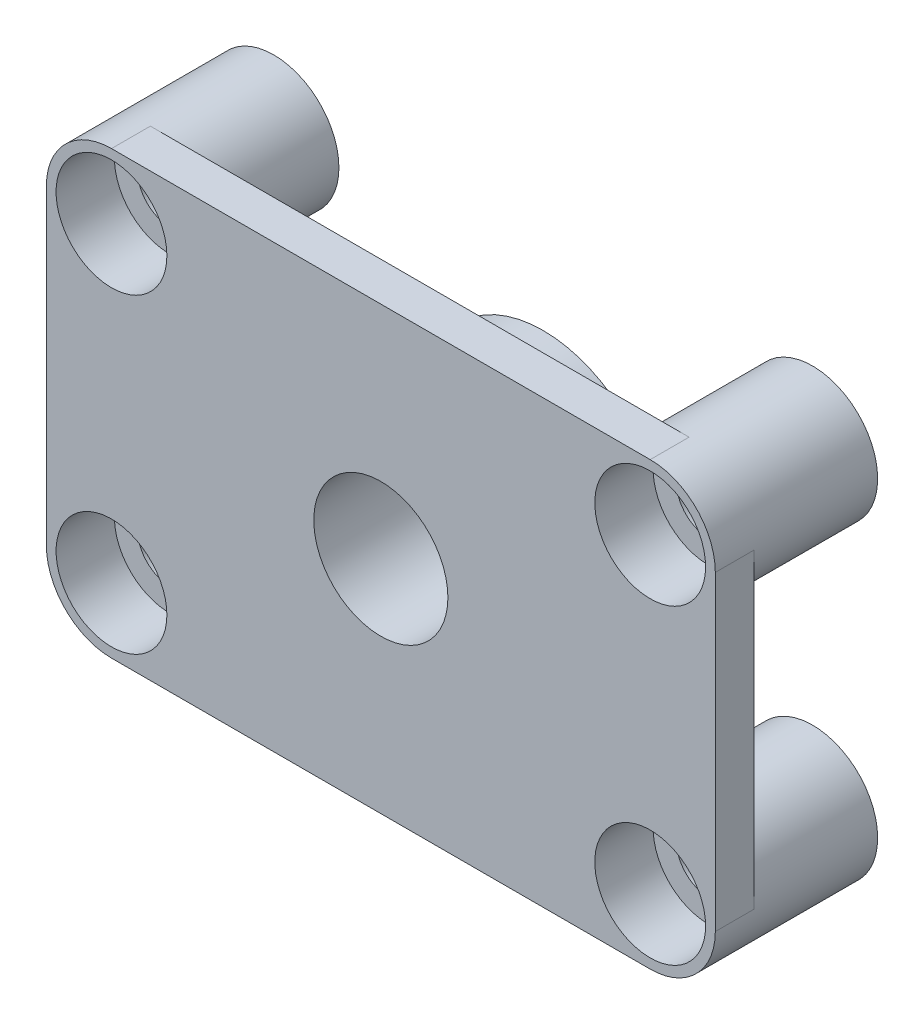
ISO-10303-21;
HEADER;
FILE_DESCRIPTION(('STEP AP214'),'2;1');
FILE_NAME('part.step','',(''),(''),'','','');
FILE_SCHEMA(('AUTOMOTIVE_DESIGN { 1 0 10303 214 1 1 1 1 }'));
ENDSEC;
DATA;
#1=APPLICATION_CONTEXT('core data for automotive mechanical design processes');
#2=APPLICATION_PROTOCOL_DEFINITION('international standard','automotive_design',2000,#1);
#3=PRODUCT_CONTEXT('',#1,'mechanical');
#4=PRODUCT('Part','Part','',(#3));
#5=PRODUCT_RELATED_PRODUCT_CATEGORY('part','',(#4));
#6=PRODUCT_DEFINITION_FORMATION('','',#4);
#7=PRODUCT_DEFINITION_CONTEXT('part definition',#1,'design');
#8=PRODUCT_DEFINITION('design','',#6,#7);
#9=PRODUCT_DEFINITION_SHAPE('','',#8);
#10=(LENGTH_UNIT() NAMED_UNIT(*) SI_UNIT(.MILLI.,.METRE.));
#11=(NAMED_UNIT(*) PLANE_ANGLE_UNIT() SI_UNIT($,.RADIAN.));
#12=(NAMED_UNIT(*) SI_UNIT($,.STERADIAN.) SOLID_ANGLE_UNIT());
#13=UNCERTAINTY_MEASURE_WITH_UNIT(LENGTH_MEASURE(1.E-05),#10,'distance_accuracy_value','');
#14=(GEOMETRIC_REPRESENTATION_CONTEXT(3) GLOBAL_UNCERTAINTY_ASSIGNED_CONTEXT((#13)) GLOBAL_UNIT_ASSIGNED_CONTEXT((#10,
#11,#12)) REPRESENTATION_CONTEXT('',''));
#15=CARTESIAN_POINT('',(0.,0.,0.));
#16=DIRECTION('',(0.,0.,1.));
#17=DIRECTION('',(1.,0.,0.));
#18=AXIS2_PLACEMENT_3D('',#15,#16,#17);
#19=CARTESIAN_POINT('',(-13.856406460551,8.00000000000007,6.35));
#20=DIRECTION('',(0.,0.,-1.));
#21=DIRECTION('',(-1.,0.,0.));
#22=AXIS2_PLACEMENT_3D('',#19,#20,#21);
#23=CYLINDRICAL_SURFACE('',#22,1.65);
#24=CARTESIAN_POINT('',(-13.856406460551,8.00000000000007,0.));
#25=DIRECTION('',(0.,0.,1.));
#26=DIRECTION('',(1.,0.,0.));
#27=AXIS2_PLACEMENT_3D('',#24,#25,#26);
#28=CIRCLE('',#27,1.65);
#29=CARTESIAN_POINT('',(-12.206406460551,8.00000000000007,0.));
#30=VERTEX_POINT('',#29);
#31=EDGE_CURVE('E167',#30,#30,#28,.T.);
#32=ORIENTED_EDGE('',*,*,#31,.F.);
#33=EDGE_LOOP('',(#32));
#34=FACE_BOUND('',#33,.T.);
#35=CARTESIAN_POINT('',(-13.856406460551,8.00000000000007,5.35));
#36=DIRECTION('',(0.,0.,1.));
#37=DIRECTION('',(1.,0.,0.));
#38=AXIS2_PLACEMENT_3D('',#35,#36,#37);
#39=CIRCLE('',#38,1.65);
#40=CARTESIAN_POINT('',(-12.206406460551,8.00000000000007,5.35));
#41=VERTEX_POINT('',#40);
#42=EDGE_CURVE('E49',#41,#41,#39,.T.);
#43=ORIENTED_EDGE('',*,*,#42,.T.);
#44=EDGE_LOOP('',(#43));
#45=FACE_BOUND('',#44,.T.);
#46=ADVANCED_FACE('F45',(#34,#45),#23,.F.);
#47=CARTESIAN_POINT('',(13.856406460551,-8.00000000000006,8.35));
#48=DIRECTION('',(0.,0.,-1.));
#49=DIRECTION('',(-1.,0.,0.));
#50=AXIS2_PLACEMENT_3D('',#47,#48,#49);
#51=CYLINDRICAL_SURFACE('',#50,1.65);
#52=CARTESIAN_POINT('',(13.856406460551,-8.00000000000006,0.));
#53=DIRECTION('',(0.,0.,1.));
#54=DIRECTION('',(1.,0.,0.));
#55=AXIS2_PLACEMENT_3D('',#52,#53,#54);
#56=CIRCLE('',#55,1.65);
#57=CARTESIAN_POINT('',(15.506406460551,-8.00000000000006,0.));
#58=VERTEX_POINT('',#57);
#59=EDGE_CURVE('E222',#58,#58,#56,.T.);
#60=ORIENTED_EDGE('',*,*,#59,.F.);
#61=EDGE_LOOP('',(#60));
#62=FACE_BOUND('',#61,.T.);
#63=CARTESIAN_POINT('',(13.856406460551,-8.00000000000006,5.35));
#64=DIRECTION('',(0.,0.,1.));
#65=DIRECTION('',(1.,0.,0.));
#66=AXIS2_PLACEMENT_3D('',#63,#64,#65);
#67=CIRCLE('',#66,1.65);
#68=CARTESIAN_POINT('',(15.506406460551,-8.00000000000006,5.35));
#69=VERTEX_POINT('',#68);
#70=EDGE_CURVE('E185',#69,#69,#67,.T.);
#71=ORIENTED_EDGE('',*,*,#70,.T.);
#72=EDGE_LOOP('',(#71));
#73=FACE_BOUND('',#72,.T.);
#74=ADVANCED_FACE('F304',(#62,#73),#51,.F.);
#75=CARTESIAN_POINT('',(13.856406460551,8.00000000000007,8.35));
#76=DIRECTION('',(0.,0.,-1.));
#77=DIRECTION('',(-1.,0.,0.));
#78=AXIS2_PLACEMENT_3D('',#75,#76,#77);
#79=CYLINDRICAL_SURFACE('',#78,1.65);
#80=CARTESIAN_POINT('',(13.856406460551,8.00000000000007,0.));
#81=DIRECTION('',(0.,0.,1.));
#82=DIRECTION('',(-1.,0.,0.));
#83=AXIS2_PLACEMENT_3D('',#80,#81,#82);
#84=CIRCLE('',#83,1.65);
#85=CARTESIAN_POINT('',(12.206406460551,8.00000000000007,0.));
#86=VERTEX_POINT('',#85);
#87=EDGE_CURVE('E212',#86,#86,#84,.T.);
#88=ORIENTED_EDGE('',*,*,#87,.F.);
#89=EDGE_LOOP('',(#88));
#90=FACE_BOUND('',#89,.T.);
#91=CARTESIAN_POINT('',(13.856406460551,8.00000000000007,5.35));
#92=DIRECTION('',(0.,0.,1.));
#93=DIRECTION('',(1.,0.,0.));
#94=AXIS2_PLACEMENT_3D('',#91,#92,#93);
#95=CIRCLE('',#94,1.65);
#96=CARTESIAN_POINT('',(15.506406460551,8.00000000000007,5.35));
#97=VERTEX_POINT('',#96);
#98=EDGE_CURVE('E181',#97,#97,#95,.T.);
#99=ORIENTED_EDGE('',*,*,#98,.T.);
#100=EDGE_LOOP('',(#99));
#101=FACE_BOUND('',#100,.T.);
#102=ADVANCED_FACE('F310',(#90,#101),#79,.F.);
#103=CARTESIAN_POINT('',(-13.856406460551,-8.00000000000006,8.35));
#104=DIRECTION('',(0.,0.,-1.));
#105=DIRECTION('',(-1.,0.,0.));
#106=AXIS2_PLACEMENT_3D('',#103,#104,#105);
#107=CYLINDRICAL_SURFACE('',#106,1.65);
#108=CARTESIAN_POINT('',(-13.856406460551,-8.00000000000006,0.));
#109=DIRECTION('',(0.,0.,1.));
#110=DIRECTION('',(-1.,0.,0.));
#111=AXIS2_PLACEMENT_3D('',#108,#109,#110);
#112=CIRCLE('',#111,1.65);
#113=CARTESIAN_POINT('',(-15.506406460551,-8.00000000000006,0.));
#114=VERTEX_POINT('',#113);
#115=EDGE_CURVE('E233',#114,#114,#112,.T.);
#116=ORIENTED_EDGE('',*,*,#115,.F.);
#117=EDGE_LOOP('',(#116));
#118=FACE_BOUND('',#117,.T.);
#119=CARTESIAN_POINT('',(-13.856406460551,-8.00000000000006,5.35));
#120=DIRECTION('',(0.,0.,1.));
#121=DIRECTION('',(1.,0.,0.));
#122=AXIS2_PLACEMENT_3D('',#119,#120,#121);
#123=CIRCLE('',#122,1.65);
#124=CARTESIAN_POINT('',(-12.206406460551,-8.00000000000006,5.35));
#125=VERTEX_POINT('',#124);
#126=EDGE_CURVE('E177',#125,#125,#123,.T.);
#127=ORIENTED_EDGE('',*,*,#126,.T.);
#128=EDGE_LOOP('',(#127));
#129=FACE_BOUND('',#128,.T.);
#130=ADVANCED_FACE('F315',(#118,#129),#107,.F.);
#131=CARTESIAN_POINT('',(0.,0.,6.35));
#132=DIRECTION('',(0.,0.,1.));
#133=DIRECTION('',(1.,0.,0.));
#134=AXIS2_PLACEMENT_3D('',#131,#132,#133);
#135=PLANE('',#134);
#136=CARTESIAN_POINT('',(13.856406460551,8.00000000000007,6.35));
#137=DIRECTION('',(0.,0.,1.));
#138=DIRECTION('',(-1.,0.,0.));
#139=AXIS2_PLACEMENT_3D('',#136,#137,#138);
#140=CIRCLE('',#139,3.35);
#141=CARTESIAN_POINT('',(13.856406460551,11.3500000000001,6.35));
#142=VERTEX_POINT('',#141);
#143=CARTESIAN_POINT('',(17.206406460551,8.00000000000007,6.35));
#144=VERTEX_POINT('',#143);
#145=EDGE_CURVE('E91',#142,#144,#140,.T.);
#146=ORIENTED_EDGE('',*,*,#145,.T.);
#147=DIRECTION('',(0.,1.,0.));
#148=VECTOR('',#147,1.);
#149=CARTESIAN_POINT('',(17.206406460551,0.,6.35));
#150=LINE('',#149,#148);
#151=CARTESIAN_POINT('',(17.206406460551,-8.00000000000006,6.35));
#152=VERTEX_POINT('',#151);
#153=EDGE_CURVE('E245',#152,#144,#150,.T.);
#154=ORIENTED_EDGE('',*,*,#153,.F.);
#155=CARTESIAN_POINT('',(13.856406460551,-8.00000000000006,6.35));
#156=DIRECTION('',(0.,0.,1.));
#157=DIRECTION('',(1.,0.,0.));
#158=AXIS2_PLACEMENT_3D('',#155,#156,#157);
#159=CIRCLE('',#158,3.35);
#160=CARTESIAN_POINT('',(13.856406460551,-11.3500000000001,6.35));
#161=VERTEX_POINT('',#160);
#162=EDGE_CURVE('E141',#152,#161,#159,.T.);
#163=ORIENTED_EDGE('',*,*,#162,.T.);
#164=DIRECTION('',(-1.,0.,0.));
#165=VECTOR('',#164,1.);
#166=CARTESIAN_POINT('',(0.,-11.3500000000001,6.35));
#167=LINE('',#166,#165);
#168=CARTESIAN_POINT('',(-13.856406460551,-11.3500000000001,6.35));
#169=VERTEX_POINT('',#168);
#170=EDGE_CURVE('E271',#161,#169,#167,.T.);
#171=ORIENTED_EDGE('',*,*,#170,.T.);
#172=CARTESIAN_POINT('',(-13.856406460551,-8.00000000000006,6.35));
#173=DIRECTION('',(0.,0.,1.));
#174=DIRECTION('',(-1.,0.,0.));
#175=AXIS2_PLACEMENT_3D('',#172,#173,#174);
#176=CIRCLE('',#175,3.35);
#177=CARTESIAN_POINT('',(-17.206406460551,-8.00000000000006,6.35));
#178=VERTEX_POINT('',#177);
#179=EDGE_CURVE('E228',#169,#178,#176,.T.);
#180=ORIENTED_EDGE('',*,*,#179,.T.);
#181=DIRECTION('',(0.,-1.,0.));
#182=VECTOR('',#181,1.);
#183=CARTESIAN_POINT('',(-17.206406460551,0.,6.35));
#184=LINE('',#183,#182);
#185=CARTESIAN_POINT('',(-17.206406460551,8.00000000000006,6.35));
#186=VERTEX_POINT('',#185);
#187=EDGE_CURVE('E267',#186,#178,#184,.T.);
#188=ORIENTED_EDGE('',*,*,#187,.F.);
#189=CARTESIAN_POINT('',(-13.856406460551,8.00000000000006,6.35));
#190=DIRECTION('',(0.,0.,1.));
#191=DIRECTION('',(1.,0.,0.));
#192=AXIS2_PLACEMENT_3D('',#189,#190,#191);
#193=CIRCLE('',#192,3.35);
#194=CARTESIAN_POINT('',(-13.856406460551,11.3500000000001,6.35));
#195=VERTEX_POINT('',#194);
#196=EDGE_CURVE('E55',#186,#195,#193,.T.);
#197=ORIENTED_EDGE('',*,*,#196,.T.);
#198=DIRECTION('',(1.,0.,0.));
#199=VECTOR('',#198,1.);
#200=CARTESIAN_POINT('',(0.,11.3500000000001,6.35));
#201=LINE('',#200,#199);
#202=EDGE_CURVE('E240',#195,#142,#201,.T.);
#203=ORIENTED_EDGE('',*,*,#202,.T.);
#204=EDGE_LOOP('',(#146,#154,#163,#171,#180,#188,#197,#203));
#205=FACE_BOUND('',#204,.T.);
#206=CARTESIAN_POINT('',(0.,0.,6.35));
#207=DIRECTION('',(0.,0.,1.));
#208=DIRECTION('',(1.,0.,0.));
#209=AXIS2_PLACEMENT_3D('',#206,#207,#208);
#210=CIRCLE('',#209,6.);
#211=CARTESIAN_POINT('',(6.,0.,6.35));
#212=VERTEX_POINT('',#211);
#213=EDGE_CURVE('E11',#212,#212,#210,.F.);
#214=ORIENTED_EDGE('',*,*,#213,.F.);
#215=EDGE_LOOP('',(#214));
#216=FACE_BOUND('',#215,.T.);
#217=ADVANCED_FACE('F279',(#205,#216),#135,.F.);
#218=CARTESIAN_POINT('',(-13.856406460551,8.00000000000006,0.));
#219=DIRECTION('',(0.,0.,1.));
#220=DIRECTION('',(1.,0.,0.));
#221=AXIS2_PLACEMENT_3D('',#218,#219,#220);
#222=PLANE('',#221);
#223=CARTESIAN_POINT('',(-13.856406460551,8.00000000000006,0.));
#224=DIRECTION('',(0.,0.,1.));
#225=DIRECTION('',(1.,0.,0.));
#226=AXIS2_PLACEMENT_3D('',#223,#224,#225);
#227=CIRCLE('',#226,3.35);
#228=CARTESIAN_POINT('',(-10.506406460551,8.00000000000006,0.));
#229=VERTEX_POINT('',#228);
#230=EDGE_CURVE('E171',#229,#229,#227,.T.);
#231=ORIENTED_EDGE('',*,*,#230,.F.);
#232=EDGE_LOOP('',(#231));
#233=FACE_BOUND('',#232,.T.);
#234=ORIENTED_EDGE('',*,*,#31,.T.);
#235=EDGE_LOOP('',(#234));
#236=FACE_BOUND('',#235,.T.);
#237=ADVANCED_FACE('F317',(#233,#236),#222,.F.);
#238=CARTESIAN_POINT('',(-13.856406460551,8.00000000000006,6.35));
#239=DIRECTION('',(0.,0.,-1.));
#240=DIRECTION('',(-1.,0.,0.));
#241=AXIS2_PLACEMENT_3D('',#238,#239,#240);
#242=CYLINDRICAL_SURFACE('',#241,3.35);
#243=ORIENTED_EDGE('',*,*,#196,.F.);
#244=DIRECTION('',(0.,0.,-1.));
#245=VECTOR('',#244,1.);
#246=CARTESIAN_POINT('',(-17.206406460551,8.00000000000006,8.35));
#247=LINE('',#246,#245);
#248=CARTESIAN_POINT('',(-17.206406460551,8.00000000000006,8.35));
#249=VERTEX_POINT('',#248);
#250=EDGE_CURVE('E161',#249,#186,#247,.T.);
#251=ORIENTED_EDGE('',*,*,#250,.F.);
#252=CARTESIAN_POINT('',(-13.856406460551,8.00000000000006,8.35));
#253=DIRECTION('',(0.,0.,1.));
#254=DIRECTION('',(1.,0.,0.));
#255=AXIS2_PLACEMENT_3D('',#252,#253,#254);
#256=CIRCLE('',#255,3.35);
#257=CARTESIAN_POINT('',(-13.856406460551,11.3500000000001,8.35));
#258=VERTEX_POINT('',#257);
#259=EDGE_CURVE('E244',#258,#249,#256,.T.);
#260=ORIENTED_EDGE('',*,*,#259,.F.);
#261=DIRECTION('',(0.,0.,-1.));
#262=VECTOR('',#261,1.);
#263=CARTESIAN_POINT('',(-13.856406460551,11.3500000000001,8.35));
#264=LINE('',#263,#262);
#265=EDGE_CURVE('E99',#258,#195,#264,.T.);
#266=ORIENTED_EDGE('',*,*,#265,.T.);
#267=EDGE_LOOP('',(#243,#251,#260,#266));
#268=FACE_BOUND('',#267,.T.);
#269=ORIENTED_EDGE('',*,*,#230,.T.);
#270=EDGE_LOOP('',(#269));
#271=FACE_BOUND('',#270,.T.);
#272=ADVANCED_FACE('F47',(#268,#271),#242,.T.);
#273=CARTESIAN_POINT('',(0.,11.3500000000001,8.35));
#274=DIRECTION('',(0.,1.,0.));
#275=DIRECTION('',(0.,0.,1.));
#276=AXIS2_PLACEMENT_3D('',#273,#274,#275);
#277=PLANE('',#276);
#278=ORIENTED_EDGE('',*,*,#202,.F.);
#279=ORIENTED_EDGE('',*,*,#265,.F.);
#280=DIRECTION('',(1.,0.,0.));
#281=VECTOR('',#280,1.);
#282=CARTESIAN_POINT('',(0.,11.3500000000001,8.35));
#283=LINE('',#282,#281);
#284=CARTESIAN_POINT('',(13.856406460551,11.3500000000001,8.35));
#285=VERTEX_POINT('',#284);
#286=EDGE_CURVE('E241',#258,#285,#283,.T.);
#287=ORIENTED_EDGE('',*,*,#286,.T.);
#288=DIRECTION('',(0.,0.,-1.));
#289=VECTOR('',#288,1.);
#290=CARTESIAN_POINT('',(13.856406460551,11.3500000000001,8.35));
#291=LINE('',#290,#289);
#292=EDGE_CURVE('E150',#285,#142,#291,.T.);
#293=ORIENTED_EDGE('',*,*,#292,.T.);
#294=EDGE_LOOP('',(#278,#279,#287,#293));
#295=FACE_BOUND('',#294,.T.);
#296=ADVANCED_FACE('F277',(#295),#277,.T.);
#297=CARTESIAN_POINT('',(-17.206406460551,0.,8.35));
#298=DIRECTION('',(1.,0.,0.));
#299=DIRECTION('',(0.,1.,0.));
#300=AXIS2_PLACEMENT_3D('',#297,#298,#299);
#301=PLANE('',#300);
#302=ORIENTED_EDGE('',*,*,#187,.T.);
#303=DIRECTION('',(0.,0.,-1.));
#304=VECTOR('',#303,1.);
#305=CARTESIAN_POINT('',(-17.206406460551,-8.00000000000006,8.35));
#306=LINE('',#305,#304);
#307=CARTESIAN_POINT('',(-17.206406460551,-8.00000000000006,8.35));
#308=VERTEX_POINT('',#307);
#309=EDGE_CURVE('E157',#308,#178,#306,.T.);
#310=ORIENTED_EDGE('',*,*,#309,.F.);
#311=DIRECTION('',(0.,-1.,0.));
#312=VECTOR('',#311,1.);
#313=CARTESIAN_POINT('',(-17.206406460551,0.,8.35));
#314=LINE('',#313,#312);
#315=EDGE_CURVE('E249',#249,#308,#314,.T.);
#316=ORIENTED_EDGE('',*,*,#315,.F.);
#317=ORIENTED_EDGE('',*,*,#250,.T.);
#318=EDGE_LOOP('',(#302,#310,#316,#317));
#319=FACE_BOUND('',#318,.T.);
#320=ADVANCED_FACE('F286',(#319),#301,.F.);
#321=CARTESIAN_POINT('',(-13.856406460551,-8.00000000000006,8.35));
#322=DIRECTION('',(0.,0.,-1.));
#323=DIRECTION('',(-1.,0.,0.));
#324=AXIS2_PLACEMENT_3D('',#321,#322,#323);
#325=CYLINDRICAL_SURFACE('',#324,3.35);
#326=ORIENTED_EDGE('',*,*,#309,.T.);
#327=ORIENTED_EDGE('',*,*,#179,.F.);
#328=DIRECTION('',(0.,0.,-1.));
#329=VECTOR('',#328,1.);
#330=CARTESIAN_POINT('',(-13.856406460551,-11.3500000000001,8.35));
#331=LINE('',#330,#329);
#332=CARTESIAN_POINT('',(-13.856406460551,-11.3500000000001,8.35));
#333=VERTEX_POINT('',#332);
#334=EDGE_CURVE('E148',#333,#169,#331,.T.);
#335=ORIENTED_EDGE('',*,*,#334,.F.);
#336=CARTESIAN_POINT('',(-13.856406460551,-8.00000000000006,8.35));
#337=DIRECTION('',(0.,0.,1.));
#338=DIRECTION('',(1.,0.,0.));
#339=AXIS2_PLACEMENT_3D('',#336,#337,#338);
#340=CIRCLE('',#339,3.35);
#341=EDGE_CURVE('E253',#308,#333,#340,.T.);
#342=ORIENTED_EDGE('',*,*,#341,.F.);
#343=EDGE_LOOP('',(#326,#327,#335,#342));
#344=FACE_BOUND('',#343,.T.);
#345=CARTESIAN_POINT('',(-13.856406460551,-8.00000000000006,0.));
#346=DIRECTION('',(0.,0.,1.));
#347=DIRECTION('',(-1.,0.,0.));
#348=AXIS2_PLACEMENT_3D('',#345,#346,#347);
#349=CIRCLE('',#348,3.35);
#350=CARTESIAN_POINT('',(-17.206406460551,-8.00000000000006,0.));
#351=VERTEX_POINT('',#350);
#352=EDGE_CURVE('E229',#351,#351,#349,.T.);
#353=ORIENTED_EDGE('',*,*,#352,.T.);
#354=EDGE_LOOP('',(#353));
#355=FACE_BOUND('',#354,.T.);
#356=ADVANCED_FACE('F288',(#344,#355),#325,.T.);
#357=CARTESIAN_POINT('',(0.,-11.3500000000001,8.35));
#358=DIRECTION('',(0.,-1.,0.));
#359=DIRECTION('',(1.,0.,0.));
#360=AXIS2_PLACEMENT_3D('',#357,#358,#359);
#361=PLANE('',#360);
#362=ORIENTED_EDGE('',*,*,#170,.F.);
#363=DIRECTION('',(0.,0.,-1.));
#364=VECTOR('',#363,1.);
#365=CARTESIAN_POINT('',(13.856406460551,-11.3500000000001,8.35));
#366=LINE('',#365,#364);
#367=CARTESIAN_POINT('',(13.856406460551,-11.3500000000001,8.35));
#368=VERTEX_POINT('',#367);
#369=EDGE_CURVE('E144',#368,#161,#366,.T.);
#370=ORIENTED_EDGE('',*,*,#369,.F.);
#371=DIRECTION('',(-1.,0.,0.));
#372=VECTOR('',#371,1.);
#373=CARTESIAN_POINT('',(0.,-11.3500000000001,8.35));
#374=LINE('',#373,#372);
#375=EDGE_CURVE('E133',#368,#333,#374,.T.);
#376=ORIENTED_EDGE('',*,*,#375,.T.);
#377=ORIENTED_EDGE('',*,*,#334,.T.);
#378=EDGE_LOOP('',(#362,#370,#376,#377));
#379=FACE_BOUND('',#378,.T.);
#380=ADVANCED_FACE('F294',(#379),#361,.T.);
#381=CARTESIAN_POINT('',(13.856406460551,-8.00000000000006,8.35));
#382=DIRECTION('',(0.,0.,-1.));
#383=DIRECTION('',(-1.,0.,0.));
#384=AXIS2_PLACEMENT_3D('',#381,#382,#383);
#385=CYLINDRICAL_SURFACE('',#384,3.35);
#386=ORIENTED_EDGE('',*,*,#369,.T.);
#387=ORIENTED_EDGE('',*,*,#162,.F.);
#388=DIRECTION('',(0.,0.,-1.));
#389=VECTOR('',#388,1.);
#390=CARTESIAN_POINT('',(17.206406460551,-8.00000000000006,8.35));
#391=LINE('',#390,#389);
#392=CARTESIAN_POINT('',(17.206406460551,-8.00000000000006,8.35));
#393=VERTEX_POINT('',#392);
#394=EDGE_CURVE('E123',#393,#152,#391,.T.);
#395=ORIENTED_EDGE('',*,*,#394,.F.);
#396=CARTESIAN_POINT('',(13.856406460551,-8.00000000000006,8.35));
#397=DIRECTION('',(0.,0.,1.));
#398=DIRECTION('',(1.,0.,0.));
#399=AXIS2_PLACEMENT_3D('',#396,#397,#398);
#400=CIRCLE('',#399,3.35);
#401=EDGE_CURVE('E126',#368,#393,#400,.T.);
#402=ORIENTED_EDGE('',*,*,#401,.F.);
#403=EDGE_LOOP('',(#386,#387,#395,#402));
#404=FACE_BOUND('',#403,.T.);
#405=CARTESIAN_POINT('',(13.856406460551,-8.00000000000006,0.));
#406=DIRECTION('',(0.,0.,1.));
#407=DIRECTION('',(1.,0.,0.));
#408=AXIS2_PLACEMENT_3D('',#405,#406,#407);
#409=CIRCLE('',#408,3.35);
#410=CARTESIAN_POINT('',(17.206406460551,-8.00000000000006,0.));
#411=VERTEX_POINT('',#410);
#412=EDGE_CURVE('E218',#411,#411,#409,.T.);
#413=ORIENTED_EDGE('',*,*,#412,.T.);
#414=EDGE_LOOP('',(#413));
#415=FACE_BOUND('',#414,.T.);
#416=ADVANCED_FACE('F138',(#404,#415),#385,.T.);
#417=CARTESIAN_POINT('',(17.206406460551,0.,8.35));
#418=DIRECTION('',(-1.,0.,0.));
#419=DIRECTION('',(0.,-1.,0.));
#420=AXIS2_PLACEMENT_3D('',#417,#418,#419);
#421=PLANE('',#420);
#422=ORIENTED_EDGE('',*,*,#153,.T.);
#423=DIRECTION('',(0.,0.,-1.));
#424=VECTOR('',#423,1.);
#425=CARTESIAN_POINT('',(17.206406460551,8.00000000000007,8.35));
#426=LINE('',#425,#424);
#427=CARTESIAN_POINT('',(17.206406460551,8.00000000000007,8.35));
#428=VERTEX_POINT('',#427);
#429=EDGE_CURVE('E124',#428,#144,#426,.T.);
#430=ORIENTED_EDGE('',*,*,#429,.F.);
#431=DIRECTION('',(0.,1.,0.));
#432=VECTOR('',#431,1.);
#433=CARTESIAN_POINT('',(17.206406460551,0.,8.35));
#434=LINE('',#433,#432);
#435=EDGE_CURVE('E118',#393,#428,#434,.T.);
#436=ORIENTED_EDGE('',*,*,#435,.F.);
#437=ORIENTED_EDGE('',*,*,#394,.T.);
#438=EDGE_LOOP('',(#422,#430,#436,#437));
#439=FACE_BOUND('',#438,.T.);
#440=ADVANCED_FACE('F121',(#439),#421,.F.);
#441=CARTESIAN_POINT('',(13.856406460551,8.00000000000007,8.35));
#442=DIRECTION('',(0.,0.,-1.));
#443=DIRECTION('',(-1.,0.,0.));
#444=AXIS2_PLACEMENT_3D('',#441,#442,#443);
#445=CYLINDRICAL_SURFACE('',#444,3.35);
#446=ORIENTED_EDGE('',*,*,#429,.T.);
#447=ORIENTED_EDGE('',*,*,#145,.F.);
#448=ORIENTED_EDGE('',*,*,#292,.F.);
#449=CARTESIAN_POINT('',(13.856406460551,8.00000000000007,8.35));
#450=DIRECTION('',(0.,0.,1.));
#451=DIRECTION('',(1.,0.,0.));
#452=AXIS2_PLACEMENT_3D('',#449,#450,#451);
#453=CIRCLE('',#452,3.35);
#454=EDGE_CURVE('E71',#428,#285,#453,.T.);
#455=ORIENTED_EDGE('',*,*,#454,.F.);
#456=EDGE_LOOP('',(#446,#447,#448,#455));
#457=FACE_BOUND('',#456,.T.);
#458=CARTESIAN_POINT('',(13.856406460551,8.00000000000007,0.));
#459=DIRECTION('',(0.,0.,1.));
#460=DIRECTION('',(-1.,0.,0.));
#461=AXIS2_PLACEMENT_3D('',#458,#459,#460);
#462=CIRCLE('',#461,3.35);
#463=CARTESIAN_POINT('',(10.506406460551,8.00000000000007,0.));
#464=VERTEX_POINT('',#463);
#465=EDGE_CURVE('E208',#464,#464,#462,.T.);
#466=ORIENTED_EDGE('',*,*,#465,.T.);
#467=EDGE_LOOP('',(#466));
#468=FACE_BOUND('',#467,.T.);
#469=ADVANCED_FACE('F337',(#457,#468),#445,.T.);
#470=CARTESIAN_POINT('',(0.,0.,8.35));
#471=DIRECTION('',(0.,0.,-1.));
#472=DIRECTION('',(-1.,0.,0.));
#473=AXIS2_PLACEMENT_3D('',#470,#471,#472);
#474=CYLINDRICAL_SURFACE('',#473,3.45);
#475=CARTESIAN_POINT('',(0.,0.,8.35));
#476=DIRECTION('',(0.,0.,1.));
#477=DIRECTION('',(1.,0.,0.));
#478=AXIS2_PLACEMENT_3D('',#475,#476,#477);
#479=CIRCLE('',#478,3.45);
#480=CARTESIAN_POINT('',(3.45,0.,8.35));
#481=VERTEX_POINT('',#480);
#482=EDGE_CURVE('E260',#481,#481,#479,.F.);
#483=ORIENTED_EDGE('',*,*,#482,.F.);
#484=EDGE_LOOP('',(#483));
#485=FACE_BOUND('',#484,.T.);
#486=CARTESIAN_POINT('',(0.,0.,0.));
#487=DIRECTION('',(0.,0.,1.));
#488=DIRECTION('',(1.,0.,0.));
#489=AXIS2_PLACEMENT_3D('',#486,#487,#488);
#490=CIRCLE('',#489,3.45);
#491=CARTESIAN_POINT('',(3.45,0.,0.));
#492=VERTEX_POINT('',#491);
#493=EDGE_CURVE('E197',#492,#492,#490,.T.);
#494=ORIENTED_EDGE('',*,*,#493,.F.);
#495=EDGE_LOOP('',(#494));
#496=FACE_BOUND('',#495,.T.);
#497=ADVANCED_FACE('F334',(#485,#496),#474,.F.);
#498=CARTESIAN_POINT('',(0.,0.,8.35));
#499=DIRECTION('',(0.,0.,1.));
#500=DIRECTION('',(1.,0.,0.));
#501=AXIS2_PLACEMENT_3D('',#498,#499,#500);
#502=PLANE('',#501);
#503=CARTESIAN_POINT('',(13.856406460551,8.00000000000007,8.35));
#504=DIRECTION('',(0.,0.,1.));
#505=DIRECTION('',(1.,0.,0.));
#506=AXIS2_PLACEMENT_3D('',#503,#504,#505);
#507=CIRCLE('',#506,2.85);
#508=CARTESIAN_POINT('',(16.706406460551,8.00000000000007,8.35));
#509=VERTEX_POINT('',#508);
#510=EDGE_CURVE('E669',#509,#509,#507,.T.);
#511=ORIENTED_EDGE('',*,*,#510,.F.);
#512=EDGE_LOOP('',(#511));
#513=FACE_BOUND('',#512,.T.);
#514=CARTESIAN_POINT('',(13.856406460551,-8.00000000000006,8.35));
#515=DIRECTION('',(0.,0.,1.));
#516=DIRECTION('',(1.,0.,0.));
#517=AXIS2_PLACEMENT_3D('',#514,#515,#516);
#518=CIRCLE('',#517,2.85);
#519=CARTESIAN_POINT('',(16.706406460551,-8.00000000000006,8.35));
#520=VERTEX_POINT('',#519);
#521=EDGE_CURVE('E693',#520,#520,#518,.T.);
#522=ORIENTED_EDGE('',*,*,#521,.F.);
#523=EDGE_LOOP('',(#522));
#524=FACE_BOUND('',#523,.T.);
#525=CARTESIAN_POINT('',(-13.856406460551,-8.00000000000006,8.35));
#526=DIRECTION('',(0.,0.,1.));
#527=DIRECTION('',(1.,0.,0.));
#528=AXIS2_PLACEMENT_3D('',#525,#526,#527);
#529=CIRCLE('',#528,2.85);
#530=CARTESIAN_POINT('',(-11.006406460551,-8.00000000000006,8.35));
#531=VERTEX_POINT('',#530);
#532=EDGE_CURVE('E682',#531,#531,#529,.T.);
#533=ORIENTED_EDGE('',*,*,#532,.F.);
#534=EDGE_LOOP('',(#533));
#535=FACE_BOUND('',#534,.T.);
#536=CARTESIAN_POINT('',(-13.856406460551,8.00000000000007,8.35));
#537=DIRECTION('',(0.,0.,1.));
#538=DIRECTION('',(1.,0.,0.));
#539=AXIS2_PLACEMENT_3D('',#536,#537,#538);
#540=CIRCLE('',#539,2.85);
#541=CARTESIAN_POINT('',(-11.006406460551,8.00000000000007,8.35));
#542=VERTEX_POINT('',#541);
#543=EDGE_CURVE('E205',#542,#542,#540,.T.);
#544=ORIENTED_EDGE('',*,*,#543,.F.);
#545=EDGE_LOOP('',(#544));
#546=FACE_BOUND('',#545,.T.);
#547=ORIENTED_EDGE('',*,*,#286,.F.);
#548=ORIENTED_EDGE('',*,*,#259,.T.);
#549=ORIENTED_EDGE('',*,*,#315,.T.);
#550=ORIENTED_EDGE('',*,*,#341,.T.);
#551=ORIENTED_EDGE('',*,*,#375,.F.);
#552=ORIENTED_EDGE('',*,*,#401,.T.);
#553=ORIENTED_EDGE('',*,*,#435,.T.);
#554=ORIENTED_EDGE('',*,*,#454,.T.);
#555=EDGE_LOOP('',(#547,#548,#549,#550,#551,#552,#553,#554));
#556=FACE_BOUND('',#555,.T.);
#557=ORIENTED_EDGE('',*,*,#482,.T.);
#558=EDGE_LOOP('',(#557));
#559=FACE_BOUND('',#558,.T.);
#560=ADVANCED_FACE('F130',(#513,#524,#535,#546,#556,#559),#502,.T.);
#561=CARTESIAN_POINT('',(-13.856406460551,-8.00000000000006,0.));
#562=DIRECTION('',(0.,0.,-1.));
#563=DIRECTION('',(-1.,0.,0.));
#564=AXIS2_PLACEMENT_3D('',#561,#562,#563);
#565=PLANE('',#564);
#566=ORIENTED_EDGE('',*,*,#352,.F.);
#567=EDGE_LOOP('',(#566));
#568=FACE_BOUND('',#567,.T.);
#569=ORIENTED_EDGE('',*,*,#115,.T.);
#570=EDGE_LOOP('',(#569));
#571=FACE_BOUND('',#570,.T.);
#572=ADVANCED_FACE('F361',(#568,#571),#565,.T.);
#573=CARTESIAN_POINT('',(13.856406460551,-8.00000000000006,0.));
#574=DIRECTION('',(0.,0.,1.));
#575=DIRECTION('',(1.,0.,0.));
#576=AXIS2_PLACEMENT_3D('',#573,#574,#575);
#577=PLANE('',#576);
#578=ORIENTED_EDGE('',*,*,#412,.F.);
#579=EDGE_LOOP('',(#578));
#580=FACE_BOUND('',#579,.T.);
#581=ORIENTED_EDGE('',*,*,#59,.T.);
#582=EDGE_LOOP('',(#581));
#583=FACE_BOUND('',#582,.T.);
#584=ADVANCED_FACE('F369',(#580,#583),#577,.F.);
#585=CARTESIAN_POINT('',(13.856406460551,8.00000000000007,0.));
#586=DIRECTION('',(0.,0.,-1.));
#587=DIRECTION('',(-1.,0.,0.));
#588=AXIS2_PLACEMENT_3D('',#585,#586,#587);
#589=PLANE('',#588);
#590=ORIENTED_EDGE('',*,*,#465,.F.);
#591=EDGE_LOOP('',(#590));
#592=FACE_BOUND('',#591,.T.);
#593=ORIENTED_EDGE('',*,*,#87,.T.);
#594=EDGE_LOOP('',(#593));
#595=FACE_BOUND('',#594,.T.);
#596=ADVANCED_FACE('F376',(#592,#595),#589,.T.);
#597=CARTESIAN_POINT('',(0.,0.,0.));
#598=DIRECTION('',(0.,0.,1.));
#599=DIRECTION('',(1.,0.,0.));
#600=AXIS2_PLACEMENT_3D('',#597,#598,#599);
#601=PLANE('',#600);
#602=CARTESIAN_POINT('',(0.,0.,0.));
#603=DIRECTION('',(0.,0.,1.));
#604=DIRECTION('',(1.,0.,0.));
#605=AXIS2_PLACEMENT_3D('',#602,#603,#604);
#606=CIRCLE('',#605,6.);
#607=CARTESIAN_POINT('',(6.,0.,0.));
#608=VERTEX_POINT('',#607);
#609=EDGE_CURVE('E192',#608,#608,#606,.T.);
#610=ORIENTED_EDGE('',*,*,#609,.F.);
#611=EDGE_LOOP('',(#610));
#612=FACE_BOUND('',#611,.T.);
#613=ORIENTED_EDGE('',*,*,#493,.T.);
#614=EDGE_LOOP('',(#613));
#615=FACE_BOUND('',#614,.T.);
#616=ADVANCED_FACE('F384',(#612,#615),#601,.F.);
#617=CARTESIAN_POINT('',(0.,0.,6.35));
#618=DIRECTION('',(0.,0.,-1.));
#619=DIRECTION('',(-1.,0.,0.));
#620=AXIS2_PLACEMENT_3D('',#617,#618,#619);
#621=CYLINDRICAL_SURFACE('',#620,6.);
#622=ORIENTED_EDGE('',*,*,#213,.T.);
#623=EDGE_LOOP('',(#622));
#624=FACE_BOUND('',#623,.T.);
#625=ORIENTED_EDGE('',*,*,#609,.T.);
#626=EDGE_LOOP('',(#625));
#627=FACE_BOUND('',#626,.T.);
#628=ADVANCED_FACE('F392',(#624,#627),#621,.T.);
#629=CARTESIAN_POINT('',(-13.856406460551,8.00000000000007,5.35));
#630=DIRECTION('',(0.,0.,1.));
#631=DIRECTION('',(1.,0.,0.));
#632=AXIS2_PLACEMENT_3D('',#629,#630,#631);
#633=CYLINDRICAL_SURFACE('',#632,2.85);
#634=CARTESIAN_POINT('',(-13.856406460551,8.00000000000007,5.35));
#635=DIRECTION('',(0.,0.,1.));
#636=DIRECTION('',(1.,0.,0.));
#637=AXIS2_PLACEMENT_3D('',#634,#635,#636);
#638=CIRCLE('',#637,2.85);
#639=CARTESIAN_POINT('',(-11.006406460551,8.00000000000007,5.35));
#640=VERTEX_POINT('',#639);
#641=EDGE_CURVE('E182',#640,#640,#638,.T.);
#642=ORIENTED_EDGE('',*,*,#641,.F.);
#643=EDGE_LOOP('',(#642));
#644=FACE_BOUND('',#643,.T.);
#645=ORIENTED_EDGE('',*,*,#543,.T.);
#646=EDGE_LOOP('',(#645));
#647=FACE_BOUND('',#646,.T.);
#648=ADVANCED_FACE('F400',(#644,#647),#633,.F.);
#649=CARTESIAN_POINT('',(-13.856406460551,8.00000000000007,5.35));
#650=DIRECTION('',(0.,0.,1.));
#651=DIRECTION('',(1.,0.,0.));
#652=AXIS2_PLACEMENT_3D('',#649,#650,#651);
#653=PLANE('',#652);
#654=ORIENTED_EDGE('',*,*,#42,.F.);
#655=EDGE_LOOP('',(#654));
#656=FACE_BOUND('',#655,.T.);
#657=ORIENTED_EDGE('',*,*,#641,.T.);
#658=EDGE_LOOP('',(#657));
#659=FACE_BOUND('',#658,.T.);
#660=ADVANCED_FACE('F407',(#656,#659),#653,.T.);
#661=CARTESIAN_POINT('',(-13.856406460551,-8.00000000000006,5.35));
#662=DIRECTION('',(0.,0.,1.));
#663=DIRECTION('',(1.,0.,0.));
#664=AXIS2_PLACEMENT_3D('',#661,#662,#663);
#665=CYLINDRICAL_SURFACE('',#664,2.85);
#666=CARTESIAN_POINT('',(-13.856406460551,-8.00000000000006,5.35));
#667=DIRECTION('',(0.,0.,1.));
#668=DIRECTION('',(1.,0.,0.));
#669=AXIS2_PLACEMENT_3D('',#666,#667,#668);
#670=CIRCLE('',#669,2.85);
#671=CARTESIAN_POINT('',(-11.006406460551,-8.00000000000006,5.35));
#672=VERTEX_POINT('',#671);
#673=EDGE_CURVE('E687',#672,#672,#670,.T.);
#674=ORIENTED_EDGE('',*,*,#673,.F.);
#675=EDGE_LOOP('',(#674));
#676=FACE_BOUND('',#675,.T.);
#677=ORIENTED_EDGE('',*,*,#532,.T.);
#678=EDGE_LOOP('',(#677));
#679=FACE_BOUND('',#678,.T.);
#680=ADVANCED_FACE('F415',(#676,#679),#665,.F.);
#681=CARTESIAN_POINT('',(-13.856406460551,-8.00000000000006,5.35));
#682=DIRECTION('',(0.,0.,1.));
#683=DIRECTION('',(1.,0.,0.));
#684=AXIS2_PLACEMENT_3D('',#681,#682,#683);
#685=PLANE('',#684);
#686=ORIENTED_EDGE('',*,*,#126,.F.);
#687=EDGE_LOOP('',(#686));
#688=FACE_BOUND('',#687,.T.);
#689=ORIENTED_EDGE('',*,*,#673,.T.);
#690=EDGE_LOOP('',(#689));
#691=FACE_BOUND('',#690,.T.);
#692=ADVANCED_FACE('F423',(#688,#691),#685,.T.);
#693=CARTESIAN_POINT('',(13.856406460551,-8.00000000000006,5.35));
#694=DIRECTION('',(0.,0.,1.));
#695=DIRECTION('',(1.,0.,0.));
#696=AXIS2_PLACEMENT_3D('',#693,#694,#695);
#697=CYLINDRICAL_SURFACE('',#696,2.85);
#698=CARTESIAN_POINT('',(13.856406460551,-8.00000000000006,5.35));
#699=DIRECTION('',(0.,0.,1.));
#700=DIRECTION('',(1.,0.,0.));
#701=AXIS2_PLACEMENT_3D('',#698,#699,#700);
#702=CIRCLE('',#701,2.85);
#703=CARTESIAN_POINT('',(16.706406460551,-8.00000000000006,5.35));
#704=VERTEX_POINT('',#703);
#705=EDGE_CURVE('E673',#704,#704,#702,.T.);
#706=ORIENTED_EDGE('',*,*,#705,.F.);
#707=EDGE_LOOP('',(#706));
#708=FACE_BOUND('',#707,.T.);
#709=ORIENTED_EDGE('',*,*,#521,.T.);
#710=EDGE_LOOP('',(#709));
#711=FACE_BOUND('',#710,.T.);
#712=ADVANCED_FACE('F431',(#708,#711),#697,.F.);
#713=CARTESIAN_POINT('',(13.856406460551,-8.00000000000006,5.35));
#714=DIRECTION('',(0.,0.,1.));
#715=DIRECTION('',(1.,0.,0.));
#716=AXIS2_PLACEMENT_3D('',#713,#714,#715);
#717=PLANE('',#716);
#718=ORIENTED_EDGE('',*,*,#70,.F.);
#719=EDGE_LOOP('',(#718));
#720=FACE_BOUND('',#719,.T.);
#721=ORIENTED_EDGE('',*,*,#705,.T.);
#722=EDGE_LOOP('',(#721));
#723=FACE_BOUND('',#722,.T.);
#724=ADVANCED_FACE('F439',(#720,#723),#717,.T.);
#725=CARTESIAN_POINT('',(13.856406460551,8.00000000000007,5.35));
#726=DIRECTION('',(0.,0.,1.));
#727=DIRECTION('',(1.,0.,0.));
#728=AXIS2_PLACEMENT_3D('',#725,#726,#727);
#729=CYLINDRICAL_SURFACE('',#728,2.85);
#730=CARTESIAN_POINT('',(13.856406460551,8.00000000000007,5.35));
#731=DIRECTION('',(0.,0.,1.));
#732=DIRECTION('',(1.,0.,0.));
#733=AXIS2_PLACEMENT_3D('',#730,#731,#732);
#734=CIRCLE('',#733,2.85);
#735=CARTESIAN_POINT('',(16.706406460551,8.00000000000007,5.35));
#736=VERTEX_POINT('',#735);
#737=EDGE_CURVE('E667',#736,#736,#734,.T.);
#738=ORIENTED_EDGE('',*,*,#737,.F.);
#739=EDGE_LOOP('',(#738));
#740=FACE_BOUND('',#739,.T.);
#741=ORIENTED_EDGE('',*,*,#510,.T.);
#742=EDGE_LOOP('',(#741));
#743=FACE_BOUND('',#742,.T.);
#744=ADVANCED_FACE('F447',(#740,#743),#729,.F.);
#745=CARTESIAN_POINT('',(13.856406460551,8.00000000000007,5.35));
#746=DIRECTION('',(0.,0.,1.));
#747=DIRECTION('',(1.,0.,0.));
#748=AXIS2_PLACEMENT_3D('',#745,#746,#747);
#749=PLANE('',#748);
#750=ORIENTED_EDGE('',*,*,#98,.F.);
#751=EDGE_LOOP('',(#750));
#752=FACE_BOUND('',#751,.T.);
#753=ORIENTED_EDGE('',*,*,#737,.T.);
#754=EDGE_LOOP('',(#753));
#755=FACE_BOUND('',#754,.T.);
#756=ADVANCED_FACE('F455',(#752,#755),#749,.T.);
#757=CLOSED_SHELL('',(#46,#74,#102,#130,#217,#237,#272,#296,#320,#356,#380,#416,#440,#469,#497,
#560,#572,#584,#596,#616,#628,#648,#660,#680,#692,#712,#724,#744,#756));
#758=MANIFOLD_SOLID_BREP('B2',#757);
#759=ADVANCED_BREP_SHAPE_REPRESENTATION('',(#18,#758),#14);
#760=SHAPE_DEFINITION_REPRESENTATION(#9,#759);
ENDSEC;
END-ISO-10303-21;
